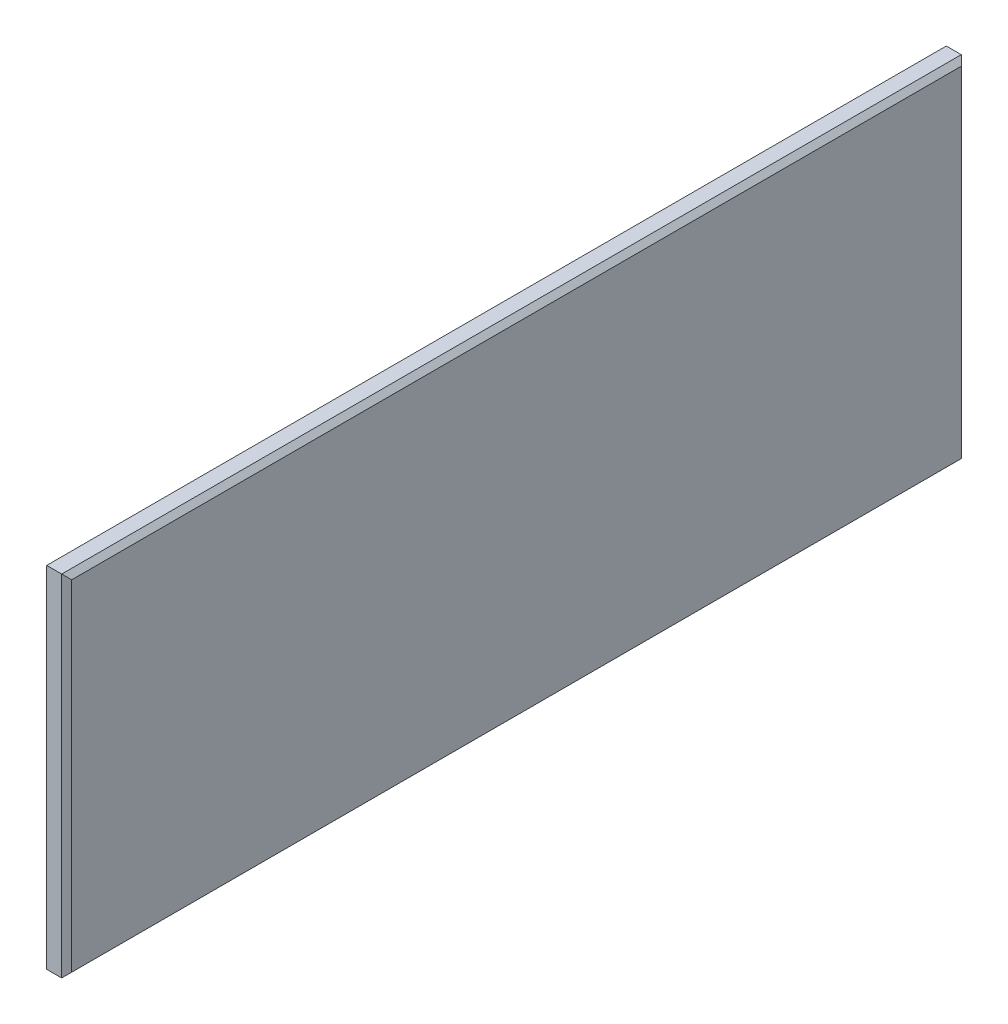
ISO-10303-21;
HEADER;
FILE_DESCRIPTION(('STEP AP214'),'2;1');
FILE_NAME('part.step','',(''),(''),'','','');
FILE_SCHEMA(('AUTOMOTIVE_DESIGN { 1 0 10303 214 1 1 1 1 }'));
ENDSEC;
DATA;
#1=APPLICATION_CONTEXT('core data for automotive mechanical design processes');
#2=APPLICATION_PROTOCOL_DEFINITION('international standard','automotive_design',2000,#1);
#3=PRODUCT_CONTEXT('',#1,'mechanical');
#4=PRODUCT('Part','Part','',(#3));
#5=PRODUCT_RELATED_PRODUCT_CATEGORY('part','',(#4));
#6=PRODUCT_DEFINITION_FORMATION('','',#4);
#7=PRODUCT_DEFINITION_CONTEXT('part definition',#1,'design');
#8=PRODUCT_DEFINITION('design','',#6,#7);
#9=PRODUCT_DEFINITION_SHAPE('','',#8);
#10=(LENGTH_UNIT() NAMED_UNIT(*) SI_UNIT(.MILLI.,.METRE.));
#11=(NAMED_UNIT(*) PLANE_ANGLE_UNIT() SI_UNIT($,.RADIAN.));
#12=(NAMED_UNIT(*) SI_UNIT($,.STERADIAN.) SOLID_ANGLE_UNIT());
#13=UNCERTAINTY_MEASURE_WITH_UNIT(LENGTH_MEASURE(1.E-05),#10,'distance_accuracy_value','');
#14=(GEOMETRIC_REPRESENTATION_CONTEXT(3) GLOBAL_UNCERTAINTY_ASSIGNED_CONTEXT((#13)) GLOBAL_UNIT_ASSIGNED_CONTEXT((#10,
#11,#12)) REPRESENTATION_CONTEXT('',''));
#15=CARTESIAN_POINT('',(0.,0.,0.));
#16=DIRECTION('',(0.,0.,1.));
#17=DIRECTION('',(1.,0.,0.));
#18=AXIS2_PLACEMENT_3D('',#15,#16,#17);
#19=CARTESIAN_POINT('',(0.,70.,0.));
#20=DIRECTION('',(1.,0.,0.));
#21=DIRECTION('',(0.,0.,-1.));
#22=AXIS2_PLACEMENT_3D('',#19,#20,#21);
#23=PLANE('',#22);
#24=DIRECTION('',(0.,0.,-1.));
#25=VECTOR('',#24,1.);
#26=CARTESIAN_POINT('',(0.,69.,0.));
#27=LINE('',#26,#25);
#28=CARTESIAN_POINT('',(0.,69.,-1.));
#29=VERTEX_POINT('',#28);
#30=CARTESIAN_POINT('',(0.,69.,-179.));
#31=VERTEX_POINT('',#30);
#32=EDGE_CURVE('E124',#29,#31,#27,.T.);
#33=ORIENTED_EDGE('',*,*,#32,.T.);
#34=DIRECTION('',(0.,-1.,0.));
#35=VECTOR('',#34,1.);
#36=CARTESIAN_POINT('',(0.,70.,-179.));
#37=LINE('',#36,#35);
#38=CARTESIAN_POINT('',(0.,1.,-179.));
#39=VERTEX_POINT('',#38);
#40=EDGE_CURVE('E106',#31,#39,#37,.T.);
#41=ORIENTED_EDGE('',*,*,#40,.T.);
#42=DIRECTION('',(0.,0.,1.));
#43=VECTOR('',#42,1.);
#44=CARTESIAN_POINT('',(0.,1.,0.));
#45=LINE('',#44,#43);
#46=CARTESIAN_POINT('',(0.,1.,-1.));
#47=VERTEX_POINT('',#46);
#48=EDGE_CURVE('E114',#39,#47,#45,.T.);
#49=ORIENTED_EDGE('',*,*,#48,.T.);
#50=DIRECTION('',(0.,1.,0.));
#51=VECTOR('',#50,1.);
#52=CARTESIAN_POINT('',(0.,70.,-1.));
#53=LINE('',#52,#51);
#54=EDGE_CURVE('E120',#47,#29,#53,.T.);
#55=ORIENTED_EDGE('',*,*,#54,.T.);
#56=EDGE_LOOP('',(#33,#41,#49,#55));
#57=FACE_BOUND('',#56,.T.);
#58=ADVANCED_FACE('F35',(#57),#23,.F.);
#59=CARTESIAN_POINT('',(0.,70.,0.));
#60=DIRECTION('',(0.,0.,-1.));
#61=DIRECTION('',(-1.,0.,0.));
#62=AXIS2_PLACEMENT_3D('',#59,#60,#61);
#63=PLANE('',#62);
#64=DIRECTION('',(1.,0.,0.));
#65=VECTOR('',#64,1.);
#66=CARTESIAN_POINT('',(0.,70.,0.));
#67=LINE('',#66,#65);
#68=CARTESIAN_POINT('',(1.,70.,0.));
#69=VERTEX_POINT('',#68);
#70=CARTESIAN_POINT('',(4.,70.,0.));
#71=VERTEX_POINT('',#70);
#72=EDGE_CURVE('E182',#69,#71,#67,.T.);
#73=ORIENTED_EDGE('',*,*,#72,.F.);
#74=DIRECTION('',(0.,-1.,0.));
#75=VECTOR('',#74,1.);
#76=CARTESIAN_POINT('',(1.,70.,0.));
#77=LINE('',#76,#75);
#78=CARTESIAN_POINT('',(1.,0.,0.));
#79=VERTEX_POINT('',#78);
#80=EDGE_CURVE('E140',#69,#79,#77,.T.);
#81=ORIENTED_EDGE('',*,*,#80,.T.);
#82=DIRECTION('',(1.,0.,0.));
#83=VECTOR('',#82,1.);
#84=CARTESIAN_POINT('',(0.,0.,0.));
#85=LINE('',#84,#83);
#86=CARTESIAN_POINT('',(4.,0.,0.));
#87=VERTEX_POINT('',#86);
#88=EDGE_CURVE('E155',#79,#87,#85,.T.);
#89=ORIENTED_EDGE('',*,*,#88,.T.);
#90=DIRECTION('',(0.,1.,0.));
#91=VECTOR('',#90,1.);
#92=CARTESIAN_POINT('',(4.,70.,0.));
#93=LINE('',#92,#91);
#94=EDGE_CURVE('E137',#87,#71,#93,.T.);
#95=ORIENTED_EDGE('',*,*,#94,.T.);
#96=EDGE_LOOP('',(#73,#81,#89,#95));
#97=FACE_BOUND('',#96,.T.);
#98=ADVANCED_FACE('F199',(#97),#63,.F.);
#99=CARTESIAN_POINT('',(5.,70.,0.));
#100=DIRECTION('',(-1.,0.,0.));
#101=DIRECTION('',(0.,0.,1.));
#102=AXIS2_PLACEMENT_3D('',#99,#100,#101);
#103=PLANE('',#102);
#104=DIRECTION('',(0.,0.,1.));
#105=VECTOR('',#104,1.);
#106=CARTESIAN_POINT('',(5.,69.,0.));
#107=LINE('',#106,#105);
#108=CARTESIAN_POINT('',(5.,69.,-179.));
#109=VERTEX_POINT('',#108);
#110=CARTESIAN_POINT('',(5.,69.,-1.));
#111=VERTEX_POINT('',#110);
#112=EDGE_CURVE('E45',#109,#111,#107,.T.);
#113=ORIENTED_EDGE('',*,*,#112,.T.);
#114=DIRECTION('',(0.,-1.,0.));
#115=VECTOR('',#114,1.);
#116=CARTESIAN_POINT('',(5.,70.,-1.));
#117=LINE('',#116,#115);
#118=CARTESIAN_POINT('',(5.,1.,-1.));
#119=VERTEX_POINT('',#118);
#120=EDGE_CURVE('E11',#111,#119,#117,.T.);
#121=ORIENTED_EDGE('',*,*,#120,.T.);
#122=DIRECTION('',(0.,0.,-1.));
#123=VECTOR('',#122,1.);
#124=CARTESIAN_POINT('',(5.,1.,-180.));
#125=LINE('',#124,#123);
#126=CARTESIAN_POINT('',(5.,1.,-179.));
#127=VERTEX_POINT('',#126);
#128=EDGE_CURVE('E146',#119,#127,#125,.T.);
#129=ORIENTED_EDGE('',*,*,#128,.T.);
#130=DIRECTION('',(0.,1.,0.));
#131=VECTOR('',#130,1.);
#132=CARTESIAN_POINT('',(5.,70.,-179.));
#133=LINE('',#132,#131);
#134=EDGE_CURVE('E56',#127,#109,#133,.T.);
#135=ORIENTED_EDGE('',*,*,#134,.T.);
#136=EDGE_LOOP('',(#113,#121,#129,#135));
#137=FACE_BOUND('',#136,.T.);
#138=ADVANCED_FACE('F206',(#137),#103,.F.);
#139=CARTESIAN_POINT('',(0.,70.,-180.));
#140=DIRECTION('',(0.,0.,1.));
#141=DIRECTION('',(1.,0.,0.));
#142=AXIS2_PLACEMENT_3D('',#139,#140,#141);
#143=PLANE('',#142);
#144=DIRECTION('',(-1.,0.,0.));
#145=VECTOR('',#144,1.);
#146=CARTESIAN_POINT('',(0.,0.,-180.));
#147=LINE('',#146,#145);
#148=CARTESIAN_POINT('',(4.,0.,-180.));
#149=VERTEX_POINT('',#148);
#150=CARTESIAN_POINT('',(1.,0.,-180.));
#151=VERTEX_POINT('',#150);
#152=EDGE_CURVE('E176',#149,#151,#147,.T.);
#153=ORIENTED_EDGE('',*,*,#152,.T.);
#154=DIRECTION('',(0.,1.,0.));
#155=VECTOR('',#154,1.);
#156=CARTESIAN_POINT('',(1.,70.,-180.));
#157=LINE('',#156,#155);
#158=CARTESIAN_POINT('',(1.,70.,-180.));
#159=VERTEX_POINT('',#158);
#160=EDGE_CURVE('E108',#151,#159,#157,.T.);
#161=ORIENTED_EDGE('',*,*,#160,.T.);
#162=DIRECTION('',(-1.,0.,0.));
#163=VECTOR('',#162,1.);
#164=CARTESIAN_POINT('',(0.,70.,-180.));
#165=LINE('',#164,#163);
#166=CARTESIAN_POINT('',(4.,70.,-180.));
#167=VERTEX_POINT('',#166);
#168=EDGE_CURVE('E121',#167,#159,#165,.T.);
#169=ORIENTED_EDGE('',*,*,#168,.F.);
#170=DIRECTION('',(0.,-1.,0.));
#171=VECTOR('',#170,1.);
#172=CARTESIAN_POINT('',(4.,70.,-180.));
#173=LINE('',#172,#171);
#174=EDGE_CURVE('E126',#167,#149,#173,.T.);
#175=ORIENTED_EDGE('',*,*,#174,.T.);
#176=EDGE_LOOP('',(#153,#161,#169,#175));
#177=FACE_BOUND('',#176,.T.);
#178=ADVANCED_FACE('F175',(#177),#143,.F.);
#179=CARTESIAN_POINT('',(0.,70.,0.));
#180=DIRECTION('',(0.,-1.,0.));
#181=DIRECTION('',(0.,0.,-1.));
#182=AXIS2_PLACEMENT_3D('',#179,#180,#181);
#183=PLANE('',#182);
#184=ORIENTED_EDGE('',*,*,#168,.T.);
#185=DIRECTION('',(0.,0.,1.));
#186=VECTOR('',#185,1.);
#187=CARTESIAN_POINT('',(1.,70.,0.));
#188=LINE('',#187,#186);
#189=EDGE_CURVE('E135',#159,#69,#188,.T.);
#190=ORIENTED_EDGE('',*,*,#189,.T.);
#191=ORIENTED_EDGE('',*,*,#72,.T.);
#192=DIRECTION('',(0.,0.,-1.));
#193=VECTOR('',#192,1.);
#194=CARTESIAN_POINT('',(4.,70.,0.));
#195=LINE('',#194,#193);
#196=EDGE_CURVE('E133',#71,#167,#195,.T.);
#197=ORIENTED_EDGE('',*,*,#196,.T.);
#198=EDGE_LOOP('',(#184,#190,#191,#197));
#199=FACE_BOUND('',#198,.T.);
#200=ADVANCED_FACE('F197',(#199),#183,.F.);
#201=CARTESIAN_POINT('',(0.,0.,0.));
#202=DIRECTION('',(0.,-1.,0.));
#203=DIRECTION('',(0.,0.,-1.));
#204=AXIS2_PLACEMENT_3D('',#201,#202,#203);
#205=PLANE('',#204);
#206=ORIENTED_EDGE('',*,*,#88,.F.);
#207=DIRECTION('',(0.,0.,-1.));
#208=VECTOR('',#207,1.);
#209=CARTESIAN_POINT('',(1.,0.,-180.));
#210=LINE('',#209,#208);
#211=EDGE_CURVE('E144',#79,#151,#210,.T.);
#212=ORIENTED_EDGE('',*,*,#211,.T.);
#213=ORIENTED_EDGE('',*,*,#152,.F.);
#214=DIRECTION('',(0.,0.,1.));
#215=VECTOR('',#214,1.);
#216=CARTESIAN_POINT('',(4.,0.,0.));
#217=LINE('',#216,#215);
#218=EDGE_CURVE('E142',#149,#87,#217,.T.);
#219=ORIENTED_EDGE('',*,*,#218,.T.);
#220=EDGE_LOOP('',(#206,#212,#213,#219));
#221=FACE_BOUND('',#220,.T.);
#222=ADVANCED_FACE('F180',(#221),#205,.T.);
#223=CARTESIAN_POINT('',(1.,70.,0.));
#224=DIRECTION('',(0.707106781186547,0.,-0.707106781186547));
#225=DIRECTION('',(0.,-1.,0.));
#226=AXIS2_PLACEMENT_3D('',#223,#224,#225);
#227=PLANE('',#226);
#228=DIRECTION('',(0.577350269189626,-0.577350269189626,0.577350269189626));
#229=VECTOR('',#228,1.);
#230=CARTESIAN_POINT('',(0.333333333333334,0.666666666666667,-0.666666666666667));
#231=LINE('',#230,#229);
#232=EDGE_CURVE('E117',#79,#47,#231,.F.);
#233=ORIENTED_EDGE('',*,*,#232,.F.);
#234=ORIENTED_EDGE('',*,*,#80,.F.);
#235=DIRECTION('',(-0.577350269189626,-0.577350269189626,-0.577350269189626));
#236=VECTOR('',#235,1.);
#237=CARTESIAN_POINT('',(1.,70.,0.));
#238=LINE('',#237,#236);
#239=EDGE_CURVE('E152',#29,#69,#238,.F.);
#240=ORIENTED_EDGE('',*,*,#239,.F.);
#241=ORIENTED_EDGE('',*,*,#54,.F.);
#242=EDGE_LOOP('',(#233,#234,#240,#241));
#243=FACE_BOUND('',#242,.T.);
#244=ADVANCED_FACE('F191',(#243),#227,.F.);
#245=CARTESIAN_POINT('',(1.,70.,0.));
#246=DIRECTION('',(0.707106781186547,-0.707106781186547,0.));
#247=DIRECTION('',(0.,0.,1.));
#248=AXIS2_PLACEMENT_3D('',#245,#246,#247);
#249=PLANE('',#248);
#250=ORIENTED_EDGE('',*,*,#239,.T.);
#251=ORIENTED_EDGE('',*,*,#189,.F.);
#252=DIRECTION('',(-0.577350269189626,-0.577350269189626,0.577350269189626));
#253=VECTOR('',#252,1.);
#254=CARTESIAN_POINT('',(-59.,10.,-120.));
#255=LINE('',#254,#253);
#256=EDGE_CURVE('E111',#31,#159,#255,.F.);
#257=ORIENTED_EDGE('',*,*,#256,.F.);
#258=ORIENTED_EDGE('',*,*,#32,.F.);
#259=EDGE_LOOP('',(#250,#251,#257,#258));
#260=FACE_BOUND('',#259,.T.);
#261=ADVANCED_FACE('F194',(#260),#249,.F.);
#262=CARTESIAN_POINT('',(0.,1.,0.));
#263=DIRECTION('',(-0.707106781186547,-0.707106781186547,0.));
#264=DIRECTION('',(0.,0.,-1.));
#265=AXIS2_PLACEMENT_3D('',#262,#263,#264);
#266=PLANE('',#265);
#267=ORIENTED_EDGE('',*,*,#232,.T.);
#268=ORIENTED_EDGE('',*,*,#48,.F.);
#269=DIRECTION('',(-0.577350269189626,0.577350269189626,0.577350269189626));
#270=VECTOR('',#269,1.);
#271=CARTESIAN_POINT('',(-59.6666666666667,60.6666666666667,-119.333333333333));
#272=LINE('',#271,#270);
#273=EDGE_CURVE('E102',#151,#39,#272,.T.);
#274=ORIENTED_EDGE('',*,*,#273,.F.);
#275=ORIENTED_EDGE('',*,*,#211,.F.);
#276=EDGE_LOOP('',(#267,#268,#274,#275));
#277=FACE_BOUND('',#276,.T.);
#278=ADVANCED_FACE('F115',(#277),#266,.T.);
#279=CARTESIAN_POINT('',(0.,70.,-179.));
#280=DIRECTION('',(0.707106781186547,0.,0.707106781186547));
#281=DIRECTION('',(0.,-1.,0.));
#282=AXIS2_PLACEMENT_3D('',#279,#280,#281);
#283=PLANE('',#282);
#284=ORIENTED_EDGE('',*,*,#256,.T.);
#285=ORIENTED_EDGE('',*,*,#160,.F.);
#286=ORIENTED_EDGE('',*,*,#273,.T.);
#287=ORIENTED_EDGE('',*,*,#40,.F.);
#288=EDGE_LOOP('',(#284,#285,#286,#287));
#289=FACE_BOUND('',#288,.T.);
#290=ADVANCED_FACE('F104',(#289),#283,.F.);
#291=CARTESIAN_POINT('',(4.,70.,-180.));
#292=DIRECTION('',(-0.707106781186547,0.,0.707106781186547));
#293=DIRECTION('',(0.,-1.,0.));
#294=AXIS2_PLACEMENT_3D('',#291,#292,#293);
#295=PLANE('',#294);
#296=DIRECTION('',(-0.577350269189626,-0.577350269189626,-0.577350269189626));
#297=VECTOR('',#296,1.);
#298=CARTESIAN_POINT('',(64.6666666666667,60.6666666666667,-119.333333333333));
#299=LINE('',#298,#297);
#300=EDGE_CURVE('E159',#149,#127,#299,.F.);
#301=ORIENTED_EDGE('',*,*,#300,.F.);
#302=ORIENTED_EDGE('',*,*,#174,.F.);
#303=DIRECTION('',(0.577350269189626,-0.577350269189626,0.577350269189626));
#304=VECTOR('',#303,1.);
#305=CARTESIAN_POINT('',(4.,70.,-180.));
#306=LINE('',#305,#304);
#307=EDGE_CURVE('E40',#109,#167,#306,.F.);
#308=ORIENTED_EDGE('',*,*,#307,.F.);
#309=ORIENTED_EDGE('',*,*,#134,.F.);
#310=EDGE_LOOP('',(#301,#302,#308,#309));
#311=FACE_BOUND('',#310,.T.);
#312=ADVANCED_FACE('F38',(#311),#295,.F.);
#313=CARTESIAN_POINT('',(4.,70.,0.));
#314=DIRECTION('',(-0.707106781186547,-0.707106781186547,0.));
#315=DIRECTION('',(0.,0.,-1.));
#316=AXIS2_PLACEMENT_3D('',#313,#314,#315);
#317=PLANE('',#316);
#318=ORIENTED_EDGE('',*,*,#307,.T.);
#319=ORIENTED_EDGE('',*,*,#196,.F.);
#320=DIRECTION('',(0.577350269189626,-0.577350269189626,-0.577350269189626));
#321=VECTOR('',#320,1.);
#322=CARTESIAN_POINT('',(4.,70.,0.));
#323=LINE('',#322,#321);
#324=EDGE_CURVE('E158',#111,#71,#323,.F.);
#325=ORIENTED_EDGE('',*,*,#324,.F.);
#326=ORIENTED_EDGE('',*,*,#112,.F.);
#327=EDGE_LOOP('',(#318,#319,#325,#326));
#328=FACE_BOUND('',#327,.T.);
#329=ADVANCED_FACE('F168',(#328),#317,.F.);
#330=CARTESIAN_POINT('',(5.,1.,0.));
#331=DIRECTION('',(0.707106781186547,-0.707106781186547,0.));
#332=DIRECTION('',(0.,0.,1.));
#333=AXIS2_PLACEMENT_3D('',#330,#331,#332);
#334=PLANE('',#333);
#335=ORIENTED_EDGE('',*,*,#300,.T.);
#336=ORIENTED_EDGE('',*,*,#128,.F.);
#337=DIRECTION('',(0.577350269189626,0.577350269189626,-0.577350269189626));
#338=VECTOR('',#337,1.);
#339=CARTESIAN_POINT('',(4.66666666666666,0.666666666666667,-0.666666666666667));
#340=LINE('',#339,#338);
#341=EDGE_CURVE('E156',#87,#119,#340,.T.);
#342=ORIENTED_EDGE('',*,*,#341,.F.);
#343=ORIENTED_EDGE('',*,*,#218,.F.);
#344=EDGE_LOOP('',(#335,#336,#342,#343));
#345=FACE_BOUND('',#344,.T.);
#346=ADVANCED_FACE('F205',(#345),#334,.T.);
#347=CARTESIAN_POINT('',(5.,70.,-1.));
#348=DIRECTION('',(-0.707106781186547,0.,-0.707106781186547));
#349=DIRECTION('',(0.,-1.,0.));
#350=AXIS2_PLACEMENT_3D('',#347,#348,#349);
#351=PLANE('',#350);
#352=ORIENTED_EDGE('',*,*,#324,.T.);
#353=ORIENTED_EDGE('',*,*,#94,.F.);
#354=ORIENTED_EDGE('',*,*,#341,.T.);
#355=ORIENTED_EDGE('',*,*,#120,.F.);
#356=EDGE_LOOP('',(#352,#353,#354,#355));
#357=FACE_BOUND('',#356,.T.);
#358=ADVANCED_FACE('F203',(#357),#351,.F.);
#359=CLOSED_SHELL('',(#58,#98,#138,#178,#200,#222,#244,#261,#278,#290,#312,#329,#346,#358));
#360=MANIFOLD_SOLID_BREP('B2',#359);
#361=ADVANCED_BREP_SHAPE_REPRESENTATION('',(#18,#360),#14);
#362=SHAPE_DEFINITION_REPRESENTATION(#9,#361);
ENDSEC;
END-ISO-10303-21;
